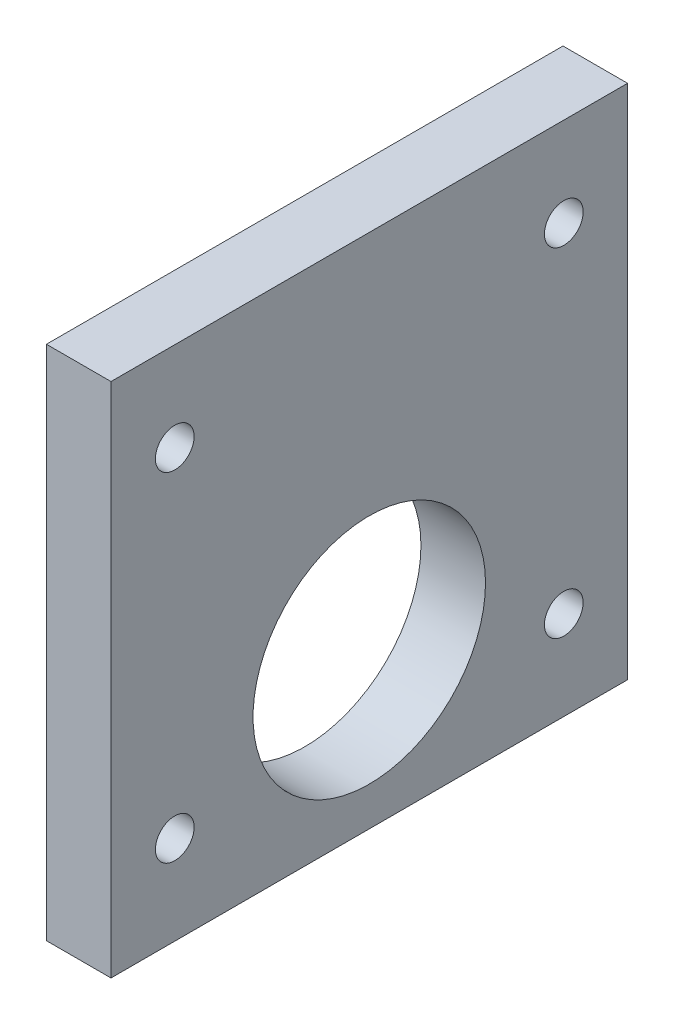
ISO-10303-21;
HEADER;
FILE_DESCRIPTION(('STEP AP214'),'2;1');
FILE_NAME('part.step','',(''),(''),'','','');
FILE_SCHEMA(('AUTOMOTIVE_DESIGN { 1 0 10303 214 1 1 1 1 }'));
ENDSEC;
DATA;
#1=APPLICATION_CONTEXT('core data for automotive mechanical design processes');
#2=APPLICATION_PROTOCOL_DEFINITION('international standard','automotive_design',2000,#1);
#3=PRODUCT_CONTEXT('',#1,'mechanical');
#4=PRODUCT('Part','Part','',(#3));
#5=PRODUCT_RELATED_PRODUCT_CATEGORY('part','',(#4));
#6=PRODUCT_DEFINITION_FORMATION('','',#4);
#7=PRODUCT_DEFINITION_CONTEXT('part definition',#1,'design');
#8=PRODUCT_DEFINITION('design','',#6,#7);
#9=PRODUCT_DEFINITION_SHAPE('','',#8);
#10=(LENGTH_UNIT() NAMED_UNIT(*) SI_UNIT(.MILLI.,.METRE.));
#11=(NAMED_UNIT(*) PLANE_ANGLE_UNIT() SI_UNIT($,.RADIAN.));
#12=(NAMED_UNIT(*) SI_UNIT($,.STERADIAN.) SOLID_ANGLE_UNIT());
#13=UNCERTAINTY_MEASURE_WITH_UNIT(LENGTH_MEASURE(1.E-05),#10,'distance_accuracy_value','');
#14=(GEOMETRIC_REPRESENTATION_CONTEXT(3) GLOBAL_UNCERTAINTY_ASSIGNED_CONTEXT((#13)) GLOBAL_UNIT_ASSIGNED_CONTEXT((#10,
#11,#12)) REPRESENTATION_CONTEXT('',''));
#15=CARTESIAN_POINT('',(0.,0.,0.));
#16=DIRECTION('',(0.,0.,1.));
#17=DIRECTION('',(1.,0.,0.));
#18=AXIS2_PLACEMENT_3D('',#15,#16,#17);
#19=CARTESIAN_POINT('',(5.,0.,0.));
#20=DIRECTION('',(-1.,0.,0.));
#21=DIRECTION('',(0.,0.,1.));
#22=AXIS2_PLACEMENT_3D('',#19,#20,#21);
#23=PLANE('',#22);
#24=DIRECTION('',(0.,0.,1.));
#25=VECTOR('',#24,1.);
#26=CARTESIAN_POINT('',(5.,0.,-13.7471951520934));
#27=LINE('',#26,#25);
#28=CARTESIAN_POINT('',(5.,0.,-53.7471951520936));
#29=VERTEX_POINT('',#28);
#30=CARTESIAN_POINT('',(5.,0.,-13.7471951520934));
#31=VERTEX_POINT('',#30);
#32=EDGE_CURVE('E85',#29,#31,#27,.T.);
#33=ORIENTED_EDGE('',*,*,#32,.T.);
#34=DIRECTION('',(0.,-1.,0.));
#35=VECTOR('',#34,1.);
#36=CARTESIAN_POINT('',(5.,0.,-13.7471951520934));
#37=LINE('',#36,#35);
#38=CARTESIAN_POINT('',(5.,-40.,-13.7471951520934));
#39=VERTEX_POINT('',#38);
#40=EDGE_CURVE('E80',#31,#39,#37,.T.);
#41=ORIENTED_EDGE('',*,*,#40,.T.);
#42=DIRECTION('',(0.,0.,-1.));
#43=VECTOR('',#42,1.);
#44=CARTESIAN_POINT('',(5.,-40.,-13.7471951520934));
#45=LINE('',#44,#43);
#46=CARTESIAN_POINT('',(5.,-40.,-53.7471951520936));
#47=VERTEX_POINT('',#46);
#48=EDGE_CURVE('E83',#39,#47,#45,.T.);
#49=ORIENTED_EDGE('',*,*,#48,.T.);
#50=DIRECTION('',(0.,1.,0.));
#51=VECTOR('',#50,1.);
#52=CARTESIAN_POINT('',(5.,0.,-53.7471951520936));
#53=LINE('',#52,#51);
#54=EDGE_CURVE('E50',#47,#29,#53,.T.);
#55=ORIENTED_EDGE('',*,*,#54,.T.);
#56=EDGE_LOOP('',(#33,#41,#49,#55));
#57=FACE_BOUND('',#56,.T.);
#58=CARTESIAN_POINT('',(5.,-6.8993353904744,-18.685090131389));
#59=DIRECTION('',(1.,0.,0.));
#60=DIRECTION('',(0.,0.,-1.));
#61=AXIS2_PLACEMENT_3D('',#58,#59,#60);
#62=CIRCLE('',#61,1.49999999999586);
#63=CARTESIAN_POINT('',(5.,-6.8993353904744,-20.1850901313849));
#64=VERTEX_POINT('',#63);
#65=EDGE_CURVE('E100',#64,#64,#62,.T.);
#66=ORIENTED_EDGE('',*,*,#65,.F.);
#67=EDGE_LOOP('',(#66));
#68=FACE_BOUND('',#67,.T.);
#69=CARTESIAN_POINT('',(5.,-28.,-33.7471951520936));
#70=DIRECTION('',(1.,0.,0.));
#71=DIRECTION('',(0.,0.,-1.));
#72=AXIS2_PLACEMENT_3D('',#69,#70,#71);
#73=CIRCLE('',#72,9.);
#74=CARTESIAN_POINT('',(5.,-28.,-42.7471951520936));
#75=VERTEX_POINT('',#74);
#76=EDGE_CURVE('E115',#75,#75,#73,.T.);
#77=ORIENTED_EDGE('',*,*,#76,.F.);
#78=EDGE_LOOP('',(#77));
#79=FACE_BOUND('',#78,.T.);
#80=CARTESIAN_POINT('',(5.,-33.1006646095256,-18.685090131389));
#81=DIRECTION('',(1.,0.,0.));
#82=DIRECTION('',(0.,0.,1.));
#83=AXIS2_PLACEMENT_3D('',#80,#81,#82);
#84=CIRCLE('',#83,1.49999999999586);
#85=CARTESIAN_POINT('',(5.,-33.1006646095256,-17.1850901313932));
#86=VERTEX_POINT('',#85);
#87=EDGE_CURVE('E121',#86,#86,#84,.T.);
#88=ORIENTED_EDGE('',*,*,#87,.F.);
#89=EDGE_LOOP('',(#88));
#90=FACE_BOUND('',#89,.T.);
#91=CARTESIAN_POINT('',(5.,-33.1006646095256,-48.8093001728024));
#92=DIRECTION('',(1.,0.,0.));
#93=DIRECTION('',(0.,0.,-1.));
#94=AXIS2_PLACEMENT_3D('',#91,#92,#93);
#95=CIRCLE('',#94,1.5);
#96=CARTESIAN_POINT('',(5.,-33.1006646095256,-50.3093001728024));
#97=VERTEX_POINT('',#96);
#98=EDGE_CURVE('E127',#97,#97,#95,.T.);
#99=ORIENTED_EDGE('',*,*,#98,.F.);
#100=EDGE_LOOP('',(#99));
#101=FACE_BOUND('',#100,.T.);
#102=CARTESIAN_POINT('',(5.,-6.89933539047429,-48.8093001728023));
#103=DIRECTION('',(1.,0.,0.));
#104=DIRECTION('',(0.,0.,1.));
#105=AXIS2_PLACEMENT_3D('',#102,#103,#104);
#106=CIRCLE('',#105,1.5);
#107=CARTESIAN_POINT('',(5.,-6.89933539047429,-47.3093001728023));
#108=VERTEX_POINT('',#107);
#109=EDGE_CURVE('E133',#108,#108,#106,.T.);
#110=ORIENTED_EDGE('',*,*,#109,.F.);
#111=EDGE_LOOP('',(#110));
#112=FACE_BOUND('',#111,.T.);
#113=ADVANCED_FACE('F33',(#57,#68,#79,#90,#101,#112),#23,.F.);
#114=CARTESIAN_POINT('',(0.,0.,0.));
#115=DIRECTION('',(-1.,0.,0.));
#116=DIRECTION('',(0.,0.,1.));
#117=AXIS2_PLACEMENT_3D('',#114,#115,#116);
#118=PLANE('',#117);
#119=CARTESIAN_POINT('',(0.,-33.1006646095256,-48.8093001728024));
#120=DIRECTION('',(1.,0.,0.));
#121=DIRECTION('',(0.,0.,-1.));
#122=AXIS2_PLACEMENT_3D('',#119,#120,#121);
#123=CIRCLE('',#122,1.5);
#124=CARTESIAN_POINT('',(0.,-33.1006646095256,-50.3093001728024));
#125=VERTEX_POINT('',#124);
#126=EDGE_CURVE('E130',#125,#125,#123,.T.);
#127=ORIENTED_EDGE('',*,*,#126,.T.);
#128=EDGE_LOOP('',(#127));
#129=FACE_BOUND('',#128,.T.);
#130=CARTESIAN_POINT('',(0.,-28.,-33.7471951520936));
#131=DIRECTION('',(1.,0.,0.));
#132=DIRECTION('',(0.,0.,-1.));
#133=AXIS2_PLACEMENT_3D('',#130,#131,#132);
#134=CIRCLE('',#133,9.);
#135=CARTESIAN_POINT('',(0.,-28.,-42.7471951520936));
#136=VERTEX_POINT('',#135);
#137=EDGE_CURVE('E118',#136,#136,#134,.T.);
#138=ORIENTED_EDGE('',*,*,#137,.T.);
#139=EDGE_LOOP('',(#138));
#140=FACE_BOUND('',#139,.T.);
#141=DIRECTION('',(0.,0.,1.));
#142=VECTOR('',#141,1.);
#143=CARTESIAN_POINT('',(0.,0.,-13.7471951520934));
#144=LINE('',#143,#142);
#145=CARTESIAN_POINT('',(0.,0.,-53.7471951520936));
#146=VERTEX_POINT('',#145);
#147=CARTESIAN_POINT('',(0.,0.,-13.7471951520934));
#148=VERTEX_POINT('',#147);
#149=EDGE_CURVE('E97',#146,#148,#144,.T.);
#150=ORIENTED_EDGE('',*,*,#149,.F.);
#151=DIRECTION('',(0.,1.,0.));
#152=VECTOR('',#151,1.);
#153=CARTESIAN_POINT('',(0.,0.,-53.7471951520936));
#154=LINE('',#153,#152);
#155=CARTESIAN_POINT('',(0.,-40.,-53.7471951520936));
#156=VERTEX_POINT('',#155);
#157=EDGE_CURVE('E73',#156,#146,#154,.T.);
#158=ORIENTED_EDGE('',*,*,#157,.F.);
#159=DIRECTION('',(0.,0.,-1.));
#160=VECTOR('',#159,1.);
#161=CARTESIAN_POINT('',(0.,-40.,-13.7471951520934));
#162=LINE('',#161,#160);
#163=CARTESIAN_POINT('',(0.,-40.,-13.7471951520934));
#164=VERTEX_POINT('',#163);
#165=EDGE_CURVE('E67',#164,#156,#162,.T.);
#166=ORIENTED_EDGE('',*,*,#165,.F.);
#167=DIRECTION('',(0.,-1.,0.));
#168=VECTOR('',#167,1.);
#169=CARTESIAN_POINT('',(0.,0.,-13.7471951520934));
#170=LINE('',#169,#168);
#171=EDGE_CURVE('E89',#148,#164,#170,.T.);
#172=ORIENTED_EDGE('',*,*,#171,.F.);
#173=EDGE_LOOP('',(#150,#158,#166,#172));
#174=FACE_BOUND('',#173,.T.);
#175=CARTESIAN_POINT('',(0.,-6.8993353904744,-18.685090131389));
#176=DIRECTION('',(1.,0.,0.));
#177=DIRECTION('',(0.,0.,-1.));
#178=AXIS2_PLACEMENT_3D('',#175,#176,#177);
#179=CIRCLE('',#178,1.49999999999586);
#180=CARTESIAN_POINT('',(0.,-6.8993353904744,-20.1850901313849));
#181=VERTEX_POINT('',#180);
#182=EDGE_CURVE('E112',#181,#181,#179,.T.);
#183=ORIENTED_EDGE('',*,*,#182,.T.);
#184=EDGE_LOOP('',(#183));
#185=FACE_BOUND('',#184,.T.);
#186=CARTESIAN_POINT('',(0.,-33.1006646095256,-18.685090131389));
#187=DIRECTION('',(1.,0.,0.));
#188=DIRECTION('',(0.,0.,1.));
#189=AXIS2_PLACEMENT_3D('',#186,#187,#188);
#190=CIRCLE('',#189,1.49999999999586);
#191=CARTESIAN_POINT('',(0.,-33.1006646095256,-17.1850901313932));
#192=VERTEX_POINT('',#191);
#193=EDGE_CURVE('E124',#192,#192,#190,.T.);
#194=ORIENTED_EDGE('',*,*,#193,.T.);
#195=EDGE_LOOP('',(#194));
#196=FACE_BOUND('',#195,.T.);
#197=CARTESIAN_POINT('',(0.,-6.89933539047429,-48.8093001728023));
#198=DIRECTION('',(1.,0.,0.));
#199=DIRECTION('',(0.,0.,1.));
#200=AXIS2_PLACEMENT_3D('',#197,#198,#199);
#201=CIRCLE('',#200,1.5);
#202=CARTESIAN_POINT('',(0.,-6.89933539047429,-47.3093001728023));
#203=VERTEX_POINT('',#202);
#204=EDGE_CURVE('E136',#203,#203,#201,.T.);
#205=ORIENTED_EDGE('',*,*,#204,.T.);
#206=EDGE_LOOP('',(#205));
#207=FACE_BOUND('',#206,.T.);
#208=ADVANCED_FACE('F108',(#129,#140,#174,#185,#196,#207),#118,.T.);
#209=CARTESIAN_POINT('',(5.,0.,-13.7471951520934));
#210=DIRECTION('',(0.,-1.,0.));
#211=DIRECTION('',(0.,0.,-1.));
#212=AXIS2_PLACEMENT_3D('',#209,#210,#211);
#213=PLANE('',#212);
#214=ORIENTED_EDGE('',*,*,#149,.T.);
#215=DIRECTION('',(-1.,0.,0.));
#216=VECTOR('',#215,1.);
#217=CARTESIAN_POINT('',(5.,0.,-13.7471951520934));
#218=LINE('',#217,#216);
#219=EDGE_CURVE('E11',#31,#148,#218,.T.);
#220=ORIENTED_EDGE('',*,*,#219,.F.);
#221=ORIENTED_EDGE('',*,*,#32,.F.);
#222=DIRECTION('',(-1.,0.,0.));
#223=VECTOR('',#222,1.);
#224=CARTESIAN_POINT('',(5.,0.,-53.7471951520936));
#225=LINE('',#224,#223);
#226=EDGE_CURVE('E93',#29,#146,#225,.T.);
#227=ORIENTED_EDGE('',*,*,#226,.T.);
#228=EDGE_LOOP('',(#214,#220,#221,#227));
#229=FACE_BOUND('',#228,.T.);
#230=ADVANCED_FACE('F35',(#229),#213,.F.);
#231=CARTESIAN_POINT('',(5.,0.,-13.7471951520934));
#232=DIRECTION('',(0.,0.,-1.));
#233=DIRECTION('',(-1.,0.,0.));
#234=AXIS2_PLACEMENT_3D('',#231,#232,#233);
#235=PLANE('',#234);
#236=ORIENTED_EDGE('',*,*,#171,.T.);
#237=DIRECTION('',(-1.,0.,0.));
#238=VECTOR('',#237,1.);
#239=CARTESIAN_POINT('',(5.,-40.,-13.7471951520934));
#240=LINE('',#239,#238);
#241=EDGE_CURVE('E42',#39,#164,#240,.T.);
#242=ORIENTED_EDGE('',*,*,#241,.F.);
#243=ORIENTED_EDGE('',*,*,#40,.F.);
#244=ORIENTED_EDGE('',*,*,#219,.T.);
#245=EDGE_LOOP('',(#236,#242,#243,#244));
#246=FACE_BOUND('',#245,.T.);
#247=ADVANCED_FACE('F88',(#246),#235,.F.);
#248=CARTESIAN_POINT('',(5.,-40.,-13.7471951520934));
#249=DIRECTION('',(0.,1.,0.));
#250=DIRECTION('',(0.,0.,1.));
#251=AXIS2_PLACEMENT_3D('',#248,#249,#250);
#252=PLANE('',#251);
#253=ORIENTED_EDGE('',*,*,#165,.T.);
#254=DIRECTION('',(-1.,0.,0.));
#255=VECTOR('',#254,1.);
#256=CARTESIAN_POINT('',(5.,-40.,-53.7471951520936));
#257=LINE('',#256,#255);
#258=EDGE_CURVE('E90',#47,#156,#257,.T.);
#259=ORIENTED_EDGE('',*,*,#258,.F.);
#260=ORIENTED_EDGE('',*,*,#48,.F.);
#261=ORIENTED_EDGE('',*,*,#241,.T.);
#262=EDGE_LOOP('',(#253,#259,#260,#261));
#263=FACE_BOUND('',#262,.T.);
#264=ADVANCED_FACE('F91',(#263),#252,.F.);
#265=CARTESIAN_POINT('',(5.,0.,-53.7471951520936));
#266=DIRECTION('',(0.,0.,1.));
#267=DIRECTION('',(1.,0.,0.));
#268=AXIS2_PLACEMENT_3D('',#265,#266,#267);
#269=PLANE('',#268);
#270=ORIENTED_EDGE('',*,*,#157,.T.);
#271=ORIENTED_EDGE('',*,*,#226,.F.);
#272=ORIENTED_EDGE('',*,*,#54,.F.);
#273=ORIENTED_EDGE('',*,*,#258,.T.);
#274=EDGE_LOOP('',(#270,#271,#272,#273));
#275=FACE_BOUND('',#274,.T.);
#276=ADVANCED_FACE('F105',(#275),#269,.F.);
#277=CARTESIAN_POINT('',(5.,-6.8993353904744,-18.685090131389));
#278=DIRECTION('',(-1.,0.,0.));
#279=DIRECTION('',(0.,0.,1.));
#280=AXIS2_PLACEMENT_3D('',#277,#278,#279);
#281=CYLINDRICAL_SURFACE('',#280,1.49999999999586);
#282=ORIENTED_EDGE('',*,*,#65,.T.);
#283=EDGE_LOOP('',(#282));
#284=FACE_BOUND('',#283,.T.);
#285=ORIENTED_EDGE('',*,*,#182,.F.);
#286=EDGE_LOOP('',(#285));
#287=FACE_BOUND('',#286,.T.);
#288=ADVANCED_FACE('F153',(#284,#287),#281,.F.);
#289=CARTESIAN_POINT('',(5.,-28.,-33.7471951520936));
#290=DIRECTION('',(-1.,0.,0.));
#291=DIRECTION('',(0.,0.,1.));
#292=AXIS2_PLACEMENT_3D('',#289,#290,#291);
#293=CYLINDRICAL_SURFACE('',#292,9.);
#294=ORIENTED_EDGE('',*,*,#76,.T.);
#295=EDGE_LOOP('',(#294));
#296=FACE_BOUND('',#295,.T.);
#297=ORIENTED_EDGE('',*,*,#137,.F.);
#298=EDGE_LOOP('',(#297));
#299=FACE_BOUND('',#298,.T.);
#300=ADVANCED_FACE('F199',(#296,#299),#293,.F.);
#301=CARTESIAN_POINT('',(5.,-33.1006646095256,-18.685090131389));
#302=DIRECTION('',(-1.,0.,0.));
#303=DIRECTION('',(0.,0.,1.));
#304=AXIS2_PLACEMENT_3D('',#301,#302,#303);
#305=CYLINDRICAL_SURFACE('',#304,1.49999999999586);
#306=ORIENTED_EDGE('',*,*,#87,.T.);
#307=EDGE_LOOP('',(#306));
#308=FACE_BOUND('',#307,.T.);
#309=ORIENTED_EDGE('',*,*,#193,.F.);
#310=EDGE_LOOP('',(#309));
#311=FACE_BOUND('',#310,.T.);
#312=ADVANCED_FACE('F207',(#308,#311),#305,.F.);
#313=CARTESIAN_POINT('',(5.,-33.1006646095256,-48.8093001728024));
#314=DIRECTION('',(-1.,0.,0.));
#315=DIRECTION('',(0.,0.,1.));
#316=AXIS2_PLACEMENT_3D('',#313,#314,#315);
#317=CYLINDRICAL_SURFACE('',#316,1.5);
#318=ORIENTED_EDGE('',*,*,#98,.T.);
#319=EDGE_LOOP('',(#318));
#320=FACE_BOUND('',#319,.T.);
#321=ORIENTED_EDGE('',*,*,#126,.F.);
#322=EDGE_LOOP('',(#321));
#323=FACE_BOUND('',#322,.T.);
#324=ADVANCED_FACE('F215',(#320,#323),#317,.F.);
#325=CARTESIAN_POINT('',(5.,-6.89933539047429,-48.8093001728023));
#326=DIRECTION('',(-1.,0.,0.));
#327=DIRECTION('',(0.,0.,1.));
#328=AXIS2_PLACEMENT_3D('',#325,#326,#327);
#329=CYLINDRICAL_SURFACE('',#328,1.5);
#330=ORIENTED_EDGE('',*,*,#109,.T.);
#331=EDGE_LOOP('',(#330));
#332=FACE_BOUND('',#331,.T.);
#333=ORIENTED_EDGE('',*,*,#204,.F.);
#334=EDGE_LOOP('',(#333));
#335=FACE_BOUND('',#334,.T.);
#336=ADVANCED_FACE('F142',(#332,#335),#329,.F.);
#337=CLOSED_SHELL('',(#113,#208,#230,#247,#264,#276,#288,#300,#312,#324,#336));
#338=MANIFOLD_SOLID_BREP('B2',#337);
#339=ADVANCED_BREP_SHAPE_REPRESENTATION('',(#18,#338),#14);
#340=SHAPE_DEFINITION_REPRESENTATION(#9,#339);
ENDSEC;
END-ISO-10303-21;
